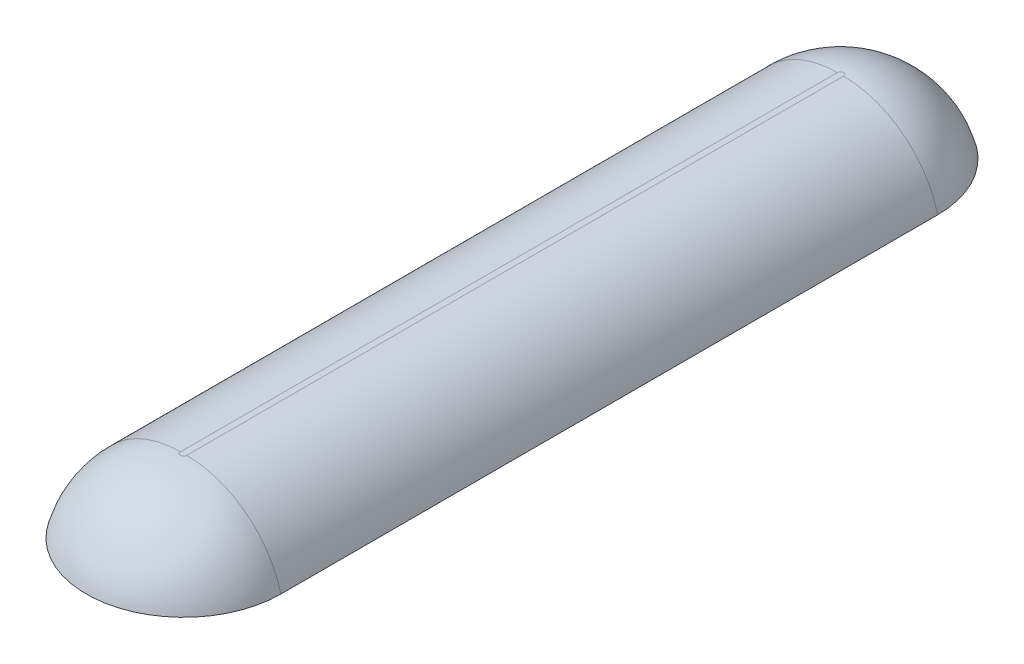
ISO-10303-21;
HEADER;
FILE_DESCRIPTION(('STEP AP214'),'2;1');
FILE_NAME('part.step','',(''),(''),'','','');
FILE_SCHEMA(('AUTOMOTIVE_DESIGN { 1 0 10303 214 1 1 1 1 }'));
ENDSEC;
DATA;
#1=APPLICATION_CONTEXT('core data for automotive mechanical design processes');
#2=APPLICATION_PROTOCOL_DEFINITION('international standard','automotive_design',2000,#1);
#3=PRODUCT_CONTEXT('',#1,'mechanical');
#4=PRODUCT('Part','Part','',(#3));
#5=PRODUCT_RELATED_PRODUCT_CATEGORY('part','',(#4));
#6=PRODUCT_DEFINITION_FORMATION('','',#4);
#7=PRODUCT_DEFINITION_CONTEXT('part definition',#1,'design');
#8=PRODUCT_DEFINITION('design','',#6,#7);
#9=PRODUCT_DEFINITION_SHAPE('','',#8);
#10=(LENGTH_UNIT() NAMED_UNIT(*) SI_UNIT(.MILLI.,.METRE.));
#11=(NAMED_UNIT(*) PLANE_ANGLE_UNIT() SI_UNIT($,.RADIAN.));
#12=(NAMED_UNIT(*) SI_UNIT($,.STERADIAN.) SOLID_ANGLE_UNIT());
#13=UNCERTAINTY_MEASURE_WITH_UNIT(LENGTH_MEASURE(1.E-05),#10,'distance_accuracy_value','');
#14=(GEOMETRIC_REPRESENTATION_CONTEXT(3) GLOBAL_UNCERTAINTY_ASSIGNED_CONTEXT((#13)) GLOBAL_UNIT_ASSIGNED_CONTEXT((#10,
#11,#12)) REPRESENTATION_CONTEXT('',''));
#15=CARTESIAN_POINT('',(0.,0.,0.));
#16=DIRECTION('',(0.,0.,1.));
#17=DIRECTION('',(1.,0.,0.));
#18=AXIS2_PLACEMENT_3D('',#15,#16,#17);
#19=CARTESIAN_POINT('',(-4.,3.,35.));
#20=DIRECTION('',(0.,-1.,0.));
#21=DIRECTION('',(0.,0.,-1.));
#22=AXIS2_PLACEMENT_3D('',#19,#20,#21);
#23=PLANE('',#22);
#24=CARTESIAN_POINT('',(0.,3.,4.));
#25=DIRECTION('',(0.,-1.,0.));
#26=DIRECTION('',(0.,0.,-1.));
#27=AXIS2_PLACEMENT_3D('',#24,#25,#26);
#28=CIRCLE('',#27,0.127016653792583);
#29=CARTESIAN_POINT('',(0.,3.,3.87298334620742));
#30=VERTEX_POINT('',#29);
#31=CARTESIAN_POINT('',(0.127016653792583,3.,4.));
#32=VERTEX_POINT('',#31);
#33=EDGE_CURVE('E91',#30,#32,#28,.T.);
#34=ORIENTED_EDGE('',*,*,#33,.F.);
#35=CARTESIAN_POINT('',(0.,3.,4.));
#36=DIRECTION('',(0.,-1.,0.));
#37=DIRECTION('',(-1.,0.,0.));
#38=AXIS2_PLACEMENT_3D('',#35,#36,#37);
#39=CIRCLE('',#38,0.127016653792583);
#40=CARTESIAN_POINT('',(-0.127016653792583,3.,4.));
#41=VERTEX_POINT('',#40);
#42=EDGE_CURVE('E86',#41,#30,#39,.T.);
#43=ORIENTED_EDGE('',*,*,#42,.F.);
#44=DIRECTION('',(0.,0.,1.));
#45=VECTOR('',#44,1.);
#46=CARTESIAN_POINT('',(-0.127016653792583,3.,35.));
#47=LINE('',#46,#45);
#48=CARTESIAN_POINT('',(-0.127016653792583,3.,31.));
#49=VERTEX_POINT('',#48);
#50=EDGE_CURVE('E79',#49,#41,#47,.F.);
#51=ORIENTED_EDGE('',*,*,#50,.F.);
#52=CARTESIAN_POINT('',(0.,3.,31.));
#53=DIRECTION('',(0.,-1.,0.));
#54=DIRECTION('',(0.,0.,1.));
#55=AXIS2_PLACEMENT_3D('',#52,#53,#54);
#56=CIRCLE('',#55,0.127016653792583);
#57=CARTESIAN_POINT('',(0.,3.,31.1270166537926));
#58=VERTEX_POINT('',#57);
#59=EDGE_CURVE('E62',#58,#49,#56,.T.);
#60=ORIENTED_EDGE('',*,*,#59,.F.);
#61=CARTESIAN_POINT('',(0.,3.,31.));
#62=DIRECTION('',(0.,-1.,0.));
#63=DIRECTION('',(1.,0.,0.));
#64=AXIS2_PLACEMENT_3D('',#61,#62,#63);
#65=CIRCLE('',#64,0.127016653792583);
#66=CARTESIAN_POINT('',(0.127016653792583,3.,31.));
#67=VERTEX_POINT('',#66);
#68=EDGE_CURVE('E148',#67,#58,#65,.T.);
#69=ORIENTED_EDGE('',*,*,#68,.F.);
#70=DIRECTION('',(0.,0.,-1.));
#71=VECTOR('',#70,1.);
#72=CARTESIAN_POINT('',(0.127016653792583,3.,35.));
#73=LINE('',#72,#71);
#74=EDGE_CURVE('E118',#32,#67,#73,.F.);
#75=ORIENTED_EDGE('',*,*,#74,.F.);
#76=EDGE_LOOP('',(#34,#43,#51,#60,#69,#75));
#77=FACE_BOUND('',#76,.T.);
#78=ADVANCED_FACE('F16',(#77),#23,.F.);
#79=CARTESIAN_POINT('',(0.127016653792583,-1.,35.));
#80=DIRECTION('',(0.,0.,-1.));
#81=DIRECTION('',(-1.,0.,0.));
#82=AXIS2_PLACEMENT_3D('',#79,#80,#81);
#83=CYLINDRICAL_SURFACE('',#82,4.);
#84=CARTESIAN_POINT('',(0.127016653792583,-1.,4.));
#85=DIRECTION('',(0.,0.,-1.));
#86=DIRECTION('',(1.,0.,0.));
#87=AXIS2_PLACEMENT_3D('',#84,#85,#86);
#88=CIRCLE('',#87,4.);
#89=CARTESIAN_POINT('',(4.,0.,4.));
#90=VERTEX_POINT('',#89);
#91=EDGE_CURVE('E49',#32,#90,#88,.T.);
#92=ORIENTED_EDGE('',*,*,#91,.F.);
#93=ORIENTED_EDGE('',*,*,#74,.T.);
#94=CARTESIAN_POINT('',(0.127016653792583,-1.,31.));
#95=DIRECTION('',(0.,0.,-1.));
#96=DIRECTION('',(-1.,0.,0.));
#97=AXIS2_PLACEMENT_3D('',#94,#95,#96);
#98=CIRCLE('',#97,4.);
#99=CARTESIAN_POINT('',(4.,0.,31.));
#100=VERTEX_POINT('',#99);
#101=EDGE_CURVE('E57',#67,#100,#98,.T.);
#102=ORIENTED_EDGE('',*,*,#101,.T.);
#103=DIRECTION('',(0.,0.,1.));
#104=VECTOR('',#103,1.);
#105=CARTESIAN_POINT('',(4.,0.,35.));
#106=LINE('',#105,#104);
#107=EDGE_CURVE('E145',#100,#90,#106,.F.);
#108=ORIENTED_EDGE('',*,*,#107,.T.);
#109=EDGE_LOOP('',(#92,#93,#102,#108));
#110=FACE_BOUND('',#109,.T.);
#111=ADVANCED_FACE('F110',(#110),#83,.T.);
#112=CARTESIAN_POINT('',(0.,-1.,4.12701665379258));
#113=DIRECTION('',(1.,0.,0.));
#114=DIRECTION('',(0.,0.,1.));
#115=AXIS2_PLACEMENT_3D('',#112,#113,#114);
#116=CIRCLE('',#115,4.);
#117=TRIMMED_CURVE('',#116,(PARAMETER_VALUE(-1.6025558290954)),
(PARAMETER_VALUE(1.6025558290954)),.T.,.PARAMETER.);
#118=CARTESIAN_POINT('',(0.,-1.,4.));
#119=DIRECTION('',(0.,1.,0.));
#120=AXIS1_PLACEMENT('',#118,#119);
#121=SURFACE_OF_REVOLUTION('',#117,#120);
#122=CARTESIAN_POINT('',(-0.127016653792583,-1.,4.));
#123=DIRECTION('',(0.,0.,1.));
#124=DIRECTION('',(1.,0.,0.));
#125=AXIS2_PLACEMENT_3D('',#122,#123,#124);
#126=CIRCLE('',#125,4.);
#127=CARTESIAN_POINT('',(-4.,0.,4.));
#128=VERTEX_POINT('',#127);
#129=EDGE_CURVE('E83',#41,#128,#126,.T.);
#130=ORIENTED_EDGE('',*,*,#129,.F.);
#131=ORIENTED_EDGE('',*,*,#42,.T.);
#132=ORIENTED_EDGE('',*,*,#33,.T.);
#133=ORIENTED_EDGE('',*,*,#91,.T.);
#134=CARTESIAN_POINT('',(0.,0.,4.));
#135=DIRECTION('',(0.,1.,0.));
#136=DIRECTION('',(0.,0.,1.));
#137=AXIS2_PLACEMENT_3D('',#134,#135,#136);
#138=CIRCLE('',#137,4.);
#139=EDGE_CURVE('E28',#90,#128,#138,.T.);
#140=ORIENTED_EDGE('',*,*,#139,.T.);
#141=EDGE_LOOP('',(#130,#131,#132,#133,#140));
#142=FACE_BOUND('',#141,.T.);
#143=ADVANCED_FACE('F96',(#142),#121,.F.);
#144=CARTESIAN_POINT('',(-0.127016653792583,-1.,35.));
#145=DIRECTION('',(0.,0.,1.));
#146=DIRECTION('',(1.,0.,0.));
#147=AXIS2_PLACEMENT_3D('',#144,#145,#146);
#148=CYLINDRICAL_SURFACE('',#147,4.);
#149=ORIENTED_EDGE('',*,*,#129,.T.);
#150=DIRECTION('',(0.,0.,1.));
#151=VECTOR('',#150,1.);
#152=CARTESIAN_POINT('',(-4.,0.,35.));
#153=LINE('',#152,#151);
#154=CARTESIAN_POINT('',(-4.,0.,31.));
#155=VERTEX_POINT('',#154);
#156=EDGE_CURVE('E11',#128,#155,#153,.T.);
#157=ORIENTED_EDGE('',*,*,#156,.T.);
#158=CARTESIAN_POINT('',(-0.127016653792583,-1.,31.));
#159=DIRECTION('',(0.,0.,1.));
#160=DIRECTION('',(-1.,0.,0.));
#161=AXIS2_PLACEMENT_3D('',#158,#159,#160);
#162=CIRCLE('',#161,4.);
#163=EDGE_CURVE('E84',#49,#155,#162,.T.);
#164=ORIENTED_EDGE('',*,*,#163,.F.);
#165=ORIENTED_EDGE('',*,*,#50,.T.);
#166=EDGE_LOOP('',(#149,#157,#164,#165));
#167=FACE_BOUND('',#166,.T.);
#168=ADVANCED_FACE('F81',(#167),#148,.T.);
#169=CARTESIAN_POINT('',(0.,-1.,31.1270166537926));
#170=DIRECTION('',(1.,0.,0.));
#171=DIRECTION('',(0.,0.,1.));
#172=AXIS2_PLACEMENT_3D('',#169,#170,#171);
#173=CIRCLE('',#172,4.);
#174=TRIMMED_CURVE('',#173,(PARAMETER_VALUE(-1.6025558290954)),
(PARAMETER_VALUE(1.6025558290954)),.T.,.PARAMETER.);
#175=CARTESIAN_POINT('',(0.,-1.,31.));
#176=DIRECTION('',(0.,1.,0.));
#177=AXIS1_PLACEMENT('',#175,#176);
#178=SURFACE_OF_REVOLUTION('',#174,#177);
#179=ORIENTED_EDGE('',*,*,#59,.T.);
#180=ORIENTED_EDGE('',*,*,#163,.T.);
#181=CARTESIAN_POINT('',(0.,0.,31.));
#182=DIRECTION('',(0.,1.,0.));
#183=DIRECTION('',(0.,0.,1.));
#184=AXIS2_PLACEMENT_3D('',#181,#182,#183);
#185=CIRCLE('',#184,4.);
#186=EDGE_CURVE('E37',#155,#100,#185,.T.);
#187=ORIENTED_EDGE('',*,*,#186,.T.);
#188=ORIENTED_EDGE('',*,*,#101,.F.);
#189=ORIENTED_EDGE('',*,*,#68,.T.);
#190=EDGE_LOOP('',(#179,#180,#187,#188,#189));
#191=FACE_BOUND('',#190,.T.);
#192=ADVANCED_FACE('F131',(#191),#178,.F.);
#193=CARTESIAN_POINT('',(-4.,0.,35.));
#194=DIRECTION('',(0.,1.,0.));
#195=DIRECTION('',(0.,0.,1.));
#196=AXIS2_PLACEMENT_3D('',#193,#194,#195);
#197=PLANE('',#196);
#198=ORIENTED_EDGE('',*,*,#156,.F.);
#199=ORIENTED_EDGE('',*,*,#139,.F.);
#200=ORIENTED_EDGE('',*,*,#107,.F.);
#201=ORIENTED_EDGE('',*,*,#186,.F.);
#202=EDGE_LOOP('',(#198,#199,#200,#201));
#203=FACE_BOUND('',#202,.T.);
#204=ADVANCED_FACE('F141',(#203),#197,.F.);
#205=CLOSED_SHELL('',(#78,#111,#143,#168,#192,#204));
#206=MANIFOLD_SOLID_BREP('B1',#205);
#207=ADVANCED_BREP_SHAPE_REPRESENTATION('',(#18,#206),#14);
#208=SHAPE_DEFINITION_REPRESENTATION(#9,#207);
ENDSEC;
END-ISO-10303-21;
